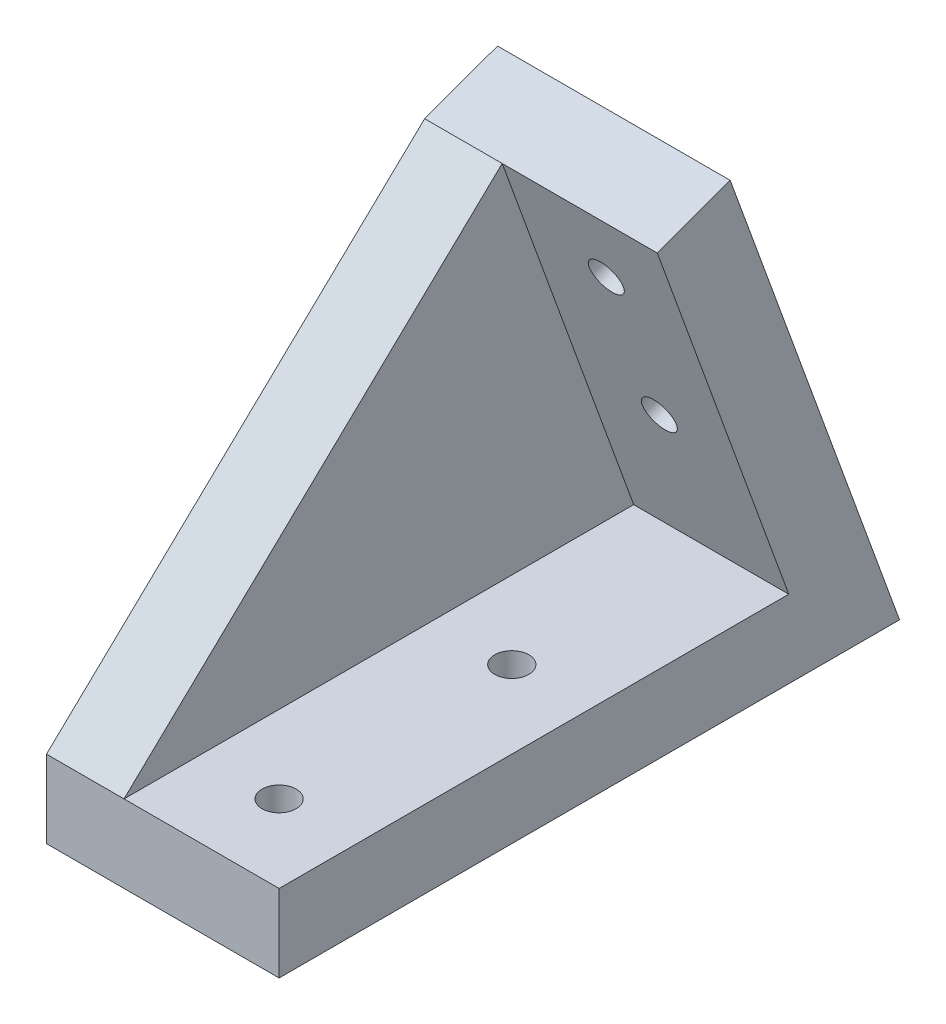
ISO-10303-21;
HEADER;
FILE_DESCRIPTION(('STEP AP214'),'2;1');
FILE_NAME('part.step','',(''),(''),'','','');
FILE_SCHEMA(('AUTOMOTIVE_DESIGN { 1 0 10303 214 1 1 1 1 }'));
ENDSEC;
DATA;
#1=APPLICATION_CONTEXT('core data for automotive mechanical design processes');
#2=APPLICATION_PROTOCOL_DEFINITION('international standard','automotive_design',2000,#1);
#3=PRODUCT_CONTEXT('',#1,'mechanical');
#4=PRODUCT('Part','Part','',(#3));
#5=PRODUCT_RELATED_PRODUCT_CATEGORY('part','',(#4));
#6=PRODUCT_DEFINITION_FORMATION('','',#4);
#7=PRODUCT_DEFINITION_CONTEXT('part definition',#1,'design');
#8=PRODUCT_DEFINITION('design','',#6,#7);
#9=PRODUCT_DEFINITION_SHAPE('','',#8);
#10=(LENGTH_UNIT() NAMED_UNIT(*) SI_UNIT(.MILLI.,.METRE.));
#11=(NAMED_UNIT(*) PLANE_ANGLE_UNIT() SI_UNIT($,.RADIAN.));
#12=(NAMED_UNIT(*) SI_UNIT($,.STERADIAN.) SOLID_ANGLE_UNIT());
#13=UNCERTAINTY_MEASURE_WITH_UNIT(LENGTH_MEASURE(1.E-05),#10,'distance_accuracy_value','');
#14=(GEOMETRIC_REPRESENTATION_CONTEXT(3) GLOBAL_UNCERTAINTY_ASSIGNED_CONTEXT((#13)) GLOBAL_UNIT_ASSIGNED_CONTEXT((#10,
#11,#12)) REPRESENTATION_CONTEXT('',''));
#15=CARTESIAN_POINT('',(0.,0.,0.));
#16=DIRECTION('',(0.,0.,1.));
#17=DIRECTION('',(1.,0.,0.));
#18=AXIS2_PLACEMENT_3D('',#15,#16,#17);
#19=CARTESIAN_POINT('',(15.,0.,40.));
#20=DIRECTION('',(-1.,0.,0.));
#21=DIRECTION('',(0.,-1.,0.));
#22=AXIS2_PLACEMENT_3D('',#19,#20,#21);
#23=PLANE('',#22);
#24=DIRECTION('',(0.,-0.939692620785909,-0.342020143325666));
#25=VECTOR('',#24,1.);
#26=CARTESIAN_POINT('',(15.,28.2898992833717,15.6175701319154));
#27=LINE('',#26,#25);
#28=CARTESIAN_POINT('',(15.,28.2898992833717,15.6175701319154));
#29=VERTEX_POINT('',#28);
#30=CARTESIAN_POINT('',(15.,5.,7.14074003371044));
#31=VERTEX_POINT('',#30);
#32=EDGE_CURVE('E111',#29,#31,#27,.T.);
#33=ORIENTED_EDGE('',*,*,#32,.F.);
#34=DIRECTION('',(0.,0.690720298393663,-0.723122029388518));
#35=VECTOR('',#34,1.);
#36=CARTESIAN_POINT('',(15.,28.2898992833717,15.6175701319154));
#37=LINE('',#36,#35);
#38=CARTESIAN_POINT('',(15.,5.,40.));
#39=VERTEX_POINT('',#38);
#40=EDGE_CURVE('E103',#39,#29,#37,.T.);
#41=ORIENTED_EDGE('',*,*,#40,.F.);
#42=DIRECTION('',(0.,0.,1.));
#43=VECTOR('',#42,1.);
#44=CARTESIAN_POINT('',(15.,5.,40.));
#45=LINE('',#44,#43);
#46=EDGE_CURVE('E65',#31,#39,#45,.T.);
#47=ORIENTED_EDGE('',*,*,#46,.F.);
#48=EDGE_LOOP('',(#33,#41,#47));
#49=FACE_BOUND('',#48,.T.);
#50=ADVANCED_FACE('F39',(#49),#23,.F.);
#51=CARTESIAN_POINT('',(0.,0.,40.));
#52=DIRECTION('',(0.,1.,0.));
#53=DIRECTION('',(0.,0.,1.));
#54=AXIS2_PLACEMENT_3D('',#51,#52,#53);
#55=PLANE('',#54);
#56=CARTESIAN_POINT('',(20.,0.,35.));
#57=DIRECTION('',(0.,-1.,0.));
#58=DIRECTION('',(0.,0.,-1.));
#59=AXIS2_PLACEMENT_3D('',#56,#57,#58);
#60=CIRCLE('',#59,1.09999999999999);
#61=CARTESIAN_POINT('',(20.,0.,33.9));
#62=VERTEX_POINT('',#61);
#63=EDGE_CURVE('E159',#62,#62,#60,.T.);
#64=ORIENTED_EDGE('',*,*,#63,.F.);
#65=EDGE_LOOP('',(#64));
#66=FACE_BOUND('',#65,.T.);
#67=CARTESIAN_POINT('',(20.,0.,20.));
#68=DIRECTION('',(0.,-1.,0.));
#69=DIRECTION('',(0.,0.,-1.));
#70=AXIS2_PLACEMENT_3D('',#67,#68,#69);
#71=CIRCLE('',#70,1.1);
#72=CARTESIAN_POINT('',(20.,0.,18.9));
#73=VERTEX_POINT('',#72);
#74=EDGE_CURVE('E171',#73,#73,#71,.T.);
#75=ORIENTED_EDGE('',*,*,#74,.F.);
#76=EDGE_LOOP('',(#75));
#77=FACE_BOUND('',#76,.T.);
#78=DIRECTION('',(1.,0.,0.));
#79=VECTOR('',#78,1.);
#80=CARTESIAN_POINT('',(0.,0.,40.));
#81=LINE('',#80,#79);
#82=CARTESIAN_POINT('',(10.,0.,40.));
#83=VERTEX_POINT('',#82);
#84=CARTESIAN_POINT('',(25.,0.,40.));
#85=VERTEX_POINT('',#84);
#86=EDGE_CURVE('E148',#83,#85,#81,.T.);
#87=ORIENTED_EDGE('',*,*,#86,.F.);
#88=DIRECTION('',(0.,0.,1.));
#89=VECTOR('',#88,1.);
#90=CARTESIAN_POINT('',(10.,0.,40.));
#91=LINE('',#90,#89);
#92=CARTESIAN_POINT('',(10.,0.,0.));
#93=VERTEX_POINT('',#92);
#94=EDGE_CURVE('E192',#93,#83,#91,.T.);
#95=ORIENTED_EDGE('',*,*,#94,.F.);
#96=DIRECTION('',(1.,0.,0.));
#97=VECTOR('',#96,1.);
#98=CARTESIAN_POINT('',(0.,0.,0.));
#99=LINE('',#98,#97);
#100=CARTESIAN_POINT('',(25.,0.,0.));
#101=VERTEX_POINT('',#100);
#102=EDGE_CURVE('E147',#93,#101,#99,.T.);
#103=ORIENTED_EDGE('',*,*,#102,.T.);
#104=DIRECTION('',(0.,0.,-1.));
#105=VECTOR('',#104,1.);
#106=CARTESIAN_POINT('',(25.,0.,0.));
#107=LINE('',#106,#105);
#108=EDGE_CURVE('E132',#85,#101,#107,.T.);
#109=ORIENTED_EDGE('',*,*,#108,.F.);
#110=EDGE_LOOP('',(#87,#95,#103,#109));
#111=FACE_BOUND('',#110,.T.);
#112=ADVANCED_FACE('F41',(#66,#77,#111),#55,.F.);
#113=CARTESIAN_POINT('',(0.,0.,40.));
#114=DIRECTION('',(0.,0.,-1.));
#115=DIRECTION('',(-1.,0.,0.));
#116=AXIS2_PLACEMENT_3D('',#113,#114,#115);
#117=PLANE('',#116);
#118=DIRECTION('',(-1.,0.,0.));
#119=VECTOR('',#118,1.);
#120=CARTESIAN_POINT('',(25.,5.,40.));
#121=LINE('',#120,#119);
#122=CARTESIAN_POINT('',(25.,5.,40.));
#123=VERTEX_POINT('',#122);
#124=EDGE_CURVE('E121',#123,#39,#121,.T.);
#125=ORIENTED_EDGE('',*,*,#124,.T.);
#126=DIRECTION('',(1.,0.,0.));
#127=VECTOR('',#126,1.);
#128=CARTESIAN_POINT('',(5.,5.,40.));
#129=LINE('',#128,#127);
#130=CARTESIAN_POINT('',(10.,5.,40.));
#131=VERTEX_POINT('',#130);
#132=EDGE_CURVE('E101',#131,#39,#129,.T.);
#133=ORIENTED_EDGE('',*,*,#132,.F.);
#134=DIRECTION('',(0.,1.,0.));
#135=VECTOR('',#134,1.);
#136=CARTESIAN_POINT('',(10.,30.,40.));
#137=LINE('',#136,#135);
#138=EDGE_CURVE('E195',#83,#131,#137,.T.);
#139=ORIENTED_EDGE('',*,*,#138,.F.);
#140=ORIENTED_EDGE('',*,*,#86,.T.);
#141=DIRECTION('',(0.,-1.,0.));
#142=VECTOR('',#141,1.);
#143=CARTESIAN_POINT('',(25.,0.,40.));
#144=LINE('',#143,#142);
#145=EDGE_CURVE('E130',#123,#85,#144,.T.);
#146=ORIENTED_EDGE('',*,*,#145,.F.);
#147=EDGE_LOOP('',(#125,#133,#139,#140,#146));
#148=FACE_BOUND('',#147,.T.);
#149=ADVANCED_FACE('F128',(#148),#117,.F.);
#150=CARTESIAN_POINT('',(-25.,0.,0.));
#151=DIRECTION('',(0.,-0.342020143325663,0.93969262078591));
#152=DIRECTION('',(0.,-0.939692620785911,-0.342020143325663));
#153=AXIS2_PLACEMENT_3D('',#150,#151,#152);
#154=PLANE('',#153);
#155=CARTESIAN_POINT('',(20.,25.3015368960704,9.20900631135755));
#156=DIRECTION('',(0.,0.342020143325663,-0.939692620785911));
#157=DIRECTION('',(0.,0.939692620785911,0.342020143325663));
#158=AXIS2_PLACEMENT_3D('',#155,#156,#157);
#159=CIRCLE('',#158,1.1);
#160=CARTESIAN_POINT('',(20.,26.335198778935,9.58522846901578));
#161=VERTEX_POINT('',#160);
#162=EDGE_CURVE('E165',#161,#161,#159,.T.);
#163=ORIENTED_EDGE('',*,*,#162,.F.);
#164=EDGE_LOOP('',(#163));
#165=FACE_BOUND('',#164,.T.);
#166=CARTESIAN_POINT('',(20.,15.9046106882113,5.78880487810092));
#167=DIRECTION('',(0.,0.342020143325663,-0.939692620785911));
#168=DIRECTION('',(0.,0.939692620785911,0.342020143325663));
#169=AXIS2_PLACEMENT_3D('',#166,#167,#168);
#170=CIRCLE('',#169,1.1);
#171=CARTESIAN_POINT('',(20.,16.9382725710758,6.16502703575915));
#172=VERTEX_POINT('',#171);
#173=EDGE_CURVE('E173',#172,#172,#170,.T.);
#174=ORIENTED_EDGE('',*,*,#173,.F.);
#175=EDGE_LOOP('',(#174));
#176=FACE_BOUND('',#175,.T.);
#177=ORIENTED_EDGE('',*,*,#102,.F.);
#178=DIRECTION('',(0.,-0.93969262078591,-0.342020143325663));
#179=VECTOR('',#178,1.);
#180=CARTESIAN_POINT('',(10.,0.,0.));
#181=LINE('',#180,#179);
#182=CARTESIAN_POINT('',(10.,30.,10.9191070279859));
#183=VERTEX_POINT('',#182);
#184=EDGE_CURVE('E188',#183,#93,#181,.T.);
#185=ORIENTED_EDGE('',*,*,#184,.F.);
#186=DIRECTION('',(-1.,0.,0.));
#187=VECTOR('',#186,1.);
#188=CARTESIAN_POINT('',(25.,30.,10.9191070279859));
#189=LINE('',#188,#187);
#190=CARTESIAN_POINT('',(25.,30.,10.9191070279859));
#191=VERTEX_POINT('',#190);
#192=EDGE_CURVE('E144',#191,#183,#189,.T.);
#193=ORIENTED_EDGE('',*,*,#192,.F.);
#194=DIRECTION('',(0.,0.93969262078591,0.342020143325663));
#195=VECTOR('',#194,1.);
#196=CARTESIAN_POINT('',(25.,0.,0.));
#197=LINE('',#196,#195);
#198=EDGE_CURVE('E126',#101,#191,#197,.T.);
#199=ORIENTED_EDGE('',*,*,#198,.F.);
#200=EDGE_LOOP('',(#177,#185,#193,#199));
#201=FACE_BOUND('',#200,.T.);
#202=ADVANCED_FACE('F231',(#165,#176,#201),#154,.F.);
#203=CARTESIAN_POINT('',(25.,30.,10.9191070279859));
#204=DIRECTION('',(0.,-0.939692620785911,-0.342020143325662));
#205=DIRECTION('',(0.,0.342020143325662,-0.939692620785911));
#206=AXIS2_PLACEMENT_3D('',#203,#204,#205);
#207=PLANE('',#206);
#208=ORIENTED_EDGE('',*,*,#192,.T.);
#209=DIRECTION('',(0.,0.342020143325662,-0.939692620785911));
#210=VECTOR('',#209,1.);
#211=CARTESIAN_POINT('',(10.,30.,10.9191070279858));
#212=LINE('',#211,#210);
#213=CARTESIAN_POINT('',(10.,28.2898992833717,15.6175701319154));
#214=VERTEX_POINT('',#213);
#215=EDGE_CURVE('E11',#214,#183,#212,.T.);
#216=ORIENTED_EDGE('',*,*,#215,.F.);
#217=DIRECTION('',(1.,0.,0.));
#218=VECTOR('',#217,1.);
#219=CARTESIAN_POINT('',(5.,28.2898992833717,15.6175701319154));
#220=LINE('',#219,#218);
#221=EDGE_CURVE('E57',#214,#29,#220,.T.);
#222=ORIENTED_EDGE('',*,*,#221,.T.);
#223=DIRECTION('',(-1.,0.,0.));
#224=VECTOR('',#223,1.);
#225=CARTESIAN_POINT('',(25.,28.2898992833717,15.6175701319154));
#226=LINE('',#225,#224);
#227=CARTESIAN_POINT('',(25.,28.2898992833717,15.6175701319154));
#228=VERTEX_POINT('',#227);
#229=EDGE_CURVE('E136',#228,#29,#226,.T.);
#230=ORIENTED_EDGE('',*,*,#229,.F.);
#231=DIRECTION('',(0.,-0.342020143325662,0.939692620785911));
#232=VECTOR('',#231,1.);
#233=CARTESIAN_POINT('',(25.,30.,10.9191070279859));
#234=LINE('',#233,#232);
#235=EDGE_CURVE('E201',#191,#228,#234,.T.);
#236=ORIENTED_EDGE('',*,*,#235,.F.);
#237=EDGE_LOOP('',(#208,#216,#222,#230,#236));
#238=FACE_BOUND('',#237,.T.);
#239=ADVANCED_FACE('F217',(#238),#207,.F.);
#240=CARTESIAN_POINT('',(25.,28.2898992833717,15.6175701319154));
#241=DIRECTION('',(0.,0.342020143325666,-0.939692620785909));
#242=DIRECTION('',(0.,0.939692620785909,0.342020143325666));
#243=AXIS2_PLACEMENT_3D('',#240,#241,#242);
#244=PLANE('',#243);
#245=CARTESIAN_POINT('',(20.,23.5914361794421,13.9074694152871));
#246=DIRECTION('',(0.,0.342020143325666,-0.939692620785909));
#247=DIRECTION('',(0.,0.939692620785909,0.342020143325666));
#248=AXIS2_PLACEMENT_3D('',#245,#246,#247);
#249=CIRCLE('',#248,1.1);
#250=CARTESIAN_POINT('',(20.,24.6250980623066,14.2836915729453));
#251=VERTEX_POINT('',#250);
#252=EDGE_CURVE('E43',#251,#251,#249,.T.);
#253=ORIENTED_EDGE('',*,*,#252,.T.);
#254=EDGE_LOOP('',(#253));
#255=FACE_BOUND('',#254,.T.);
#256=CARTESIAN_POINT('',(20.,14.194509971583,10.4872679820304));
#257=DIRECTION('',(0.,0.342020143325666,-0.939692620785909));
#258=DIRECTION('',(0.,0.939692620785909,0.342020143325666));
#259=AXIS2_PLACEMENT_3D('',#256,#257,#258);
#260=CIRCLE('',#259,1.1);
#261=CARTESIAN_POINT('',(20.,15.2281718544475,10.8634901396887));
#262=VERTEX_POINT('',#261);
#263=EDGE_CURVE('E162',#262,#262,#260,.T.);
#264=ORIENTED_EDGE('',*,*,#263,.T.);
#265=EDGE_LOOP('',(#264));
#266=FACE_BOUND('',#265,.T.);
#267=ORIENTED_EDGE('',*,*,#32,.T.);
#268=DIRECTION('',(-1.,0.,0.));
#269=VECTOR('',#268,1.);
#270=CARTESIAN_POINT('',(25.,5.,7.14074003371044));
#271=LINE('',#270,#269);
#272=CARTESIAN_POINT('',(25.,5.,7.14074003371044));
#273=VERTEX_POINT('',#272);
#274=EDGE_CURVE('E124',#273,#31,#271,.T.);
#275=ORIENTED_EDGE('',*,*,#274,.F.);
#276=DIRECTION('',(0.,-0.939692620785909,-0.342020143325666));
#277=VECTOR('',#276,1.);
#278=CARTESIAN_POINT('',(25.,28.2898992833717,15.6175701319154));
#279=LINE('',#278,#277);
#280=EDGE_CURVE('E204',#228,#273,#279,.T.);
#281=ORIENTED_EDGE('',*,*,#280,.F.);
#282=ORIENTED_EDGE('',*,*,#229,.T.);
#283=EDGE_LOOP('',(#267,#275,#281,#282));
#284=FACE_BOUND('',#283,.T.);
#285=ADVANCED_FACE('F213',(#255,#266,#284),#244,.F.);
#286=CARTESIAN_POINT('',(25.,5.,40.));
#287=DIRECTION('',(0.,-1.,0.));
#288=DIRECTION('',(1.,0.,0.));
#289=AXIS2_PLACEMENT_3D('',#286,#287,#288);
#290=PLANE('',#289);
#291=CARTESIAN_POINT('',(20.,5.,35.));
#292=DIRECTION('',(0.,-1.,0.));
#293=DIRECTION('',(1.,0.,0.));
#294=AXIS2_PLACEMENT_3D('',#291,#292,#293);
#295=CIRCLE('',#294,1.09999999999999);
#296=CARTESIAN_POINT('',(21.1,5.,35.));
#297=VERTEX_POINT('',#296);
#298=EDGE_CURVE('E114',#297,#297,#295,.T.);
#299=ORIENTED_EDGE('',*,*,#298,.T.);
#300=EDGE_LOOP('',(#299));
#301=FACE_BOUND('',#300,.T.);
#302=CARTESIAN_POINT('',(20.,5.,20.));
#303=DIRECTION('',(0.,-1.,0.));
#304=DIRECTION('',(1.,0.,0.));
#305=AXIS2_PLACEMENT_3D('',#302,#303,#304);
#306=CIRCLE('',#305,1.1);
#307=CARTESIAN_POINT('',(21.1,5.,20.));
#308=VERTEX_POINT('',#307);
#309=EDGE_CURVE('E155',#308,#308,#306,.T.);
#310=ORIENTED_EDGE('',*,*,#309,.T.);
#311=EDGE_LOOP('',(#310));
#312=FACE_BOUND('',#311,.T.);
#313=ORIENTED_EDGE('',*,*,#46,.T.);
#314=ORIENTED_EDGE('',*,*,#124,.F.);
#315=DIRECTION('',(0.,0.,1.));
#316=VECTOR('',#315,1.);
#317=CARTESIAN_POINT('',(25.,5.,40.));
#318=LINE('',#317,#316);
#319=EDGE_CURVE('E207',#273,#123,#318,.T.);
#320=ORIENTED_EDGE('',*,*,#319,.F.);
#321=ORIENTED_EDGE('',*,*,#274,.T.);
#322=EDGE_LOOP('',(#313,#314,#320,#321));
#323=FACE_BOUND('',#322,.T.);
#324=ADVANCED_FACE('F119',(#301,#312,#323),#290,.F.);
#325=CARTESIAN_POINT('',(25.,0.,0.));
#326=DIRECTION('',(1.,0.,0.));
#327=DIRECTION('',(0.,1.,0.));
#328=AXIS2_PLACEMENT_3D('',#325,#326,#327);
#329=PLANE('',#328);
#330=ORIENTED_EDGE('',*,*,#198,.T.);
#331=ORIENTED_EDGE('',*,*,#235,.T.);
#332=ORIENTED_EDGE('',*,*,#280,.T.);
#333=ORIENTED_EDGE('',*,*,#319,.T.);
#334=ORIENTED_EDGE('',*,*,#145,.T.);
#335=ORIENTED_EDGE('',*,*,#108,.T.);
#336=EDGE_LOOP('',(#330,#331,#332,#333,#334,#335));
#337=FACE_BOUND('',#336,.T.);
#338=ADVANCED_FACE('F229',(#337),#329,.T.);
#339=CARTESIAN_POINT('',(10.,0.,0.));
#340=DIRECTION('',(1.,0.,0.));
#341=DIRECTION('',(0.,1.,0.));
#342=AXIS2_PLACEMENT_3D('',#339,#340,#341);
#343=PLANE('',#342);
#344=DIRECTION('',(0.,0.690720298393663,-0.723122029388519));
#345=VECTOR('',#344,1.);
#346=CARTESIAN_POINT('',(10.,22.5935299035056,21.5811565440926));
#347=LINE('',#346,#345);
#348=EDGE_CURVE('E49',#131,#214,#347,.T.);
#349=ORIENTED_EDGE('',*,*,#348,.T.);
#350=ORIENTED_EDGE('',*,*,#215,.T.);
#351=ORIENTED_EDGE('',*,*,#184,.T.);
#352=ORIENTED_EDGE('',*,*,#94,.T.);
#353=ORIENTED_EDGE('',*,*,#138,.T.);
#354=EDGE_LOOP('',(#349,#350,#351,#352,#353));
#355=FACE_BOUND('',#354,.T.);
#356=ADVANCED_FACE('F221',(#355),#343,.F.);
#357=CARTESIAN_POINT('',(5.,28.2898992833717,15.6175701319154));
#358=DIRECTION('',(0.,-0.723122029388519,-0.690720298393663));
#359=DIRECTION('',(0.,0.690720298393663,-0.723122029388519));
#360=AXIS2_PLACEMENT_3D('',#357,#358,#359);
#361=PLANE('',#360);
#362=ORIENTED_EDGE('',*,*,#132,.T.);
#363=ORIENTED_EDGE('',*,*,#40,.T.);
#364=ORIENTED_EDGE('',*,*,#221,.F.);
#365=ORIENTED_EDGE('',*,*,#348,.F.);
#366=EDGE_LOOP('',(#362,#363,#364,#365));
#367=FACE_BOUND('',#366,.T.);
#368=ADVANCED_FACE('F102',(#367),#361,.F.);
#369=CARTESIAN_POINT('',(20.,10.,20.));
#370=DIRECTION('',(0.,-1.,0.));
#371=DIRECTION('',(0.,0.,-1.));
#372=AXIS2_PLACEMENT_3D('',#369,#370,#371);
#373=CYLINDRICAL_SURFACE('',#372,1.1);
#374=ORIENTED_EDGE('',*,*,#74,.T.);
#375=EDGE_LOOP('',(#374));
#376=FACE_BOUND('',#375,.T.);
#377=ORIENTED_EDGE('',*,*,#309,.F.);
#378=EDGE_LOOP('',(#377));
#379=FACE_BOUND('',#378,.T.);
#380=ADVANCED_FACE('F253',(#376,#379),#373,.F.);
#381=CARTESIAN_POINT('',(20.,10.,35.));
#382=DIRECTION('',(0.,-1.,0.));
#383=DIRECTION('',(0.,0.,-1.));
#384=AXIS2_PLACEMENT_3D('',#381,#382,#383);
#385=CYLINDRICAL_SURFACE('',#384,1.09999999999999);
#386=ORIENTED_EDGE('',*,*,#63,.T.);
#387=EDGE_LOOP('',(#386));
#388=FACE_BOUND('',#387,.T.);
#389=ORIENTED_EDGE('',*,*,#298,.F.);
#390=EDGE_LOOP('',(#389));
#391=FACE_BOUND('',#390,.T.);
#392=ADVANCED_FACE('F256',(#388,#391),#385,.F.);
#393=CARTESIAN_POINT('',(20.,12.4844092549547,15.18573108596));
#394=DIRECTION('',(0.,0.342020143325663,-0.93969262078591));
#395=DIRECTION('',(0.,0.939692620785911,0.342020143325663));
#396=AXIS2_PLACEMENT_3D('',#393,#394,#395);
#397=CYLINDRICAL_SURFACE('',#396,1.1);
#398=ORIENTED_EDGE('',*,*,#173,.T.);
#399=EDGE_LOOP('',(#398));
#400=FACE_BOUND('',#399,.T.);
#401=ORIENTED_EDGE('',*,*,#263,.F.);
#402=EDGE_LOOP('',(#401));
#403=FACE_BOUND('',#402,.T.);
#404=ADVANCED_FACE('F277',(#400,#403),#397,.F.);
#405=CARTESIAN_POINT('',(20.,21.8813354628138,18.6059325192167));
#406=DIRECTION('',(0.,0.342020143325663,-0.93969262078591));
#407=DIRECTION('',(0.,0.939692620785911,0.342020143325663));
#408=AXIS2_PLACEMENT_3D('',#405,#406,#407);
#409=CYLINDRICAL_SURFACE('',#408,1.1);
#410=ORIENTED_EDGE('',*,*,#162,.T.);
#411=EDGE_LOOP('',(#410));
#412=FACE_BOUND('',#411,.T.);
#413=ORIENTED_EDGE('',*,*,#252,.F.);
#414=EDGE_LOOP('',(#413));
#415=FACE_BOUND('',#414,.T.);
#416=ADVANCED_FACE('F281',(#412,#415),#409,.F.);
#417=CLOSED_SHELL('',(#50,#112,#149,#202,#239,#285,#324,#338,#356,#368,#380,#392,#404,#416));
#418=MANIFOLD_SOLID_BREP('B2',#417);
#419=ADVANCED_BREP_SHAPE_REPRESENTATION('',(#18,#418),#14);
#420=SHAPE_DEFINITION_REPRESENTATION(#9,#419);
ENDSEC;
END-ISO-10303-21;
